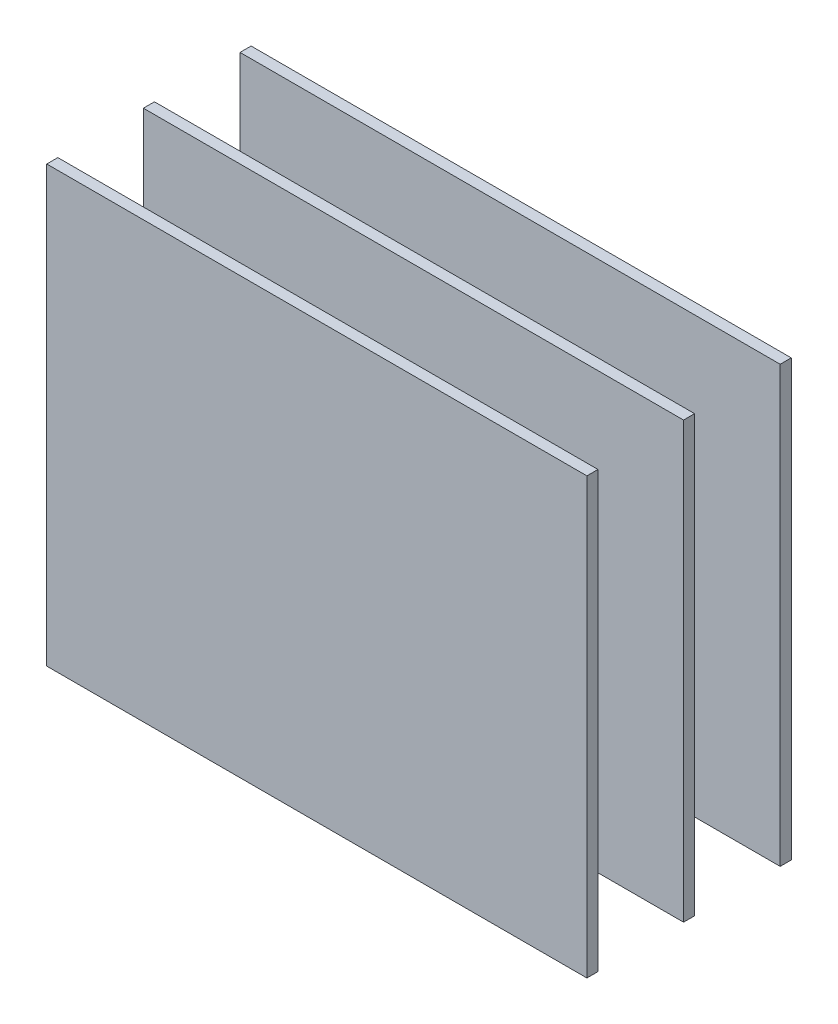
ISO-10303-21;
HEADER;
FILE_DESCRIPTION(('STEP AP214'),'2;1');
FILE_NAME('part.step','',(''),(''),'','','');
FILE_SCHEMA(('AUTOMOTIVE_DESIGN { 1 0 10303 214 1 1 1 1 }'));
ENDSEC;
DATA;
#1=APPLICATION_CONTEXT('core data for automotive mechanical design processes');
#2=APPLICATION_PROTOCOL_DEFINITION('international standard','automotive_design',2000,#1);
#3=PRODUCT_CONTEXT('',#1,'mechanical');
#4=PRODUCT('Part','Part','',(#3));
#5=PRODUCT_RELATED_PRODUCT_CATEGORY('part','',(#4));
#6=PRODUCT_DEFINITION_FORMATION('','',#4);
#7=PRODUCT_DEFINITION_CONTEXT('part definition',#1,'design');
#8=PRODUCT_DEFINITION('design','',#6,#7);
#9=PRODUCT_DEFINITION_SHAPE('','',#8);
#10=(LENGTH_UNIT() NAMED_UNIT(*) SI_UNIT(.MILLI.,.METRE.));
#11=(NAMED_UNIT(*) PLANE_ANGLE_UNIT() SI_UNIT($,.RADIAN.));
#12=(NAMED_UNIT(*) SI_UNIT($,.STERADIAN.) SOLID_ANGLE_UNIT());
#13=UNCERTAINTY_MEASURE_WITH_UNIT(LENGTH_MEASURE(1.E-05),#10,'distance_accuracy_value','');
#14=(GEOMETRIC_REPRESENTATION_CONTEXT(3) GLOBAL_UNCERTAINTY_ASSIGNED_CONTEXT((#13)) GLOBAL_UNIT_ASSIGNED_CONTEXT((#10,
#11,#12)) REPRESENTATION_CONTEXT('',''));
#15=CARTESIAN_POINT('',(0.,0.,0.));
#16=DIRECTION('',(0.,0.,1.));
#17=DIRECTION('',(1.,0.,0.));
#18=AXIS2_PLACEMENT_3D('',#15,#16,#17);
#19=CARTESIAN_POINT('',(-1.05,-0.675,0.));
#20=DIRECTION('',(0.,-1.,0.));
#21=DIRECTION('',(0.,0.,-1.));
#22=AXIS2_PLACEMENT_3D('',#19,#20,#21);
#23=PLANE('',#22);
#24=DIRECTION('',(0.,0.,-1.));
#25=VECTOR('',#24,1.);
#26=CARTESIAN_POINT('',(0.838391795984,-0.675,0.171094755903));
#27=LINE('',#26,#25);
#28=CARTESIAN_POINT('',(0.838391795984,-0.675,0.342189511805));
#29=VERTEX_POINT('',#28);
#30=CARTESIAN_POINT('',(0.838391795984,-0.675,0.307810488195));
#31=VERTEX_POINT('',#30);
#32=EDGE_CURVE('P0_E61',#29,#31,#27,.T.);
#33=ORIENTED_EDGE('',*,*,#32,.F.);
#34=DIRECTION('',(1.,0.,0.));
#35=VECTOR('',#34,1.);
#36=CARTESIAN_POINT('',(-0.944195897992,-0.675,0.342189511805));
#37=LINE('',#36,#35);
#38=CARTESIAN_POINT('',(-0.838391795984,-0.675,0.342189511805));
#39=VERTEX_POINT('',#38);
#40=EDGE_CURVE('P0_E11',#39,#29,#37,.T.);
#41=ORIENTED_EDGE('',*,*,#40,.F.);
#42=DIRECTION('',(0.,0.,1.));
#43=VECTOR('',#42,1.);
#44=CARTESIAN_POINT('',(-0.838391795984,-0.675,0.153905244097));
#45=LINE('',#44,#43);
#46=CARTESIAN_POINT('',(-0.838391795984,-0.675,0.307810488195));
#47=VERTEX_POINT('',#46);
#48=EDGE_CURVE('P0_E75',#47,#39,#45,.T.);
#49=ORIENTED_EDGE('',*,*,#48,.F.);
#50=DIRECTION('',(-1.,0.,0.));
#51=VECTOR('',#50,1.);
#52=CARTESIAN_POINT('',(-0.105804102008,-0.675,0.307810488195));
#53=LINE('',#52,#51);
#54=EDGE_CURVE('P0_E73',#31,#47,#53,.T.);
#55=ORIENTED_EDGE('',*,*,#54,.F.);
#56=EDGE_LOOP('',(#33,#41,#49,#55));
#57=FACE_BOUND('',#56,.T.);
#58=ADVANCED_FACE('P0_F17',(#57),#23,.T.);
#59=CARTESIAN_POINT('',(1.05,0.675,0.));
#60=DIRECTION('',(0.,1.,0.));
#61=DIRECTION('',(1.,0.,0.));
#62=AXIS2_PLACEMENT_3D('',#59,#60,#61);
#63=PLANE('',#62);
#64=DIRECTION('',(0.,0.,1.));
#65=VECTOR('',#64,1.);
#66=CARTESIAN_POINT('',(0.838391795984,0.675,0.171094755903));
#67=LINE('',#66,#65);
#68=CARTESIAN_POINT('',(0.838391795984,0.675,0.307810488195));
#69=VERTEX_POINT('',#68);
#70=CARTESIAN_POINT('',(0.838391795984,0.675,0.342189511805));
#71=VERTEX_POINT('',#70);
#72=EDGE_CURVE('P0_E80',#69,#71,#67,.T.);
#73=ORIENTED_EDGE('',*,*,#72,.F.);
#74=DIRECTION('',(1.,0.,0.));
#75=VECTOR('',#74,1.);
#76=CARTESIAN_POINT('',(0.944195897992,0.675,0.307810488195));
#77=LINE('',#76,#75);
#78=CARTESIAN_POINT('',(-0.838391795984,0.675,0.307810488195));
#79=VERTEX_POINT('',#78);
#80=EDGE_CURVE('P0_E84',#79,#69,#77,.T.);
#81=ORIENTED_EDGE('',*,*,#80,.F.);
#82=DIRECTION('',(0.,0.,-1.));
#83=VECTOR('',#82,1.);
#84=CARTESIAN_POINT('',(-0.838391795984,0.675,0.153905244097));
#85=LINE('',#84,#83);
#86=CARTESIAN_POINT('',(-0.838391795984,0.675,0.342189511805));
#87=VERTEX_POINT('',#86);
#88=EDGE_CURVE('P0_E124',#87,#79,#85,.T.);
#89=ORIENTED_EDGE('',*,*,#88,.F.);
#90=DIRECTION('',(-1.,0.,0.));
#91=VECTOR('',#90,1.);
#92=CARTESIAN_POINT('',(0.105804102008,0.675,0.342189511805));
#93=LINE('',#92,#91);
#94=EDGE_CURVE('P0_E20',#71,#87,#93,.T.);
#95=ORIENTED_EDGE('',*,*,#94,.F.);
#96=EDGE_LOOP('',(#73,#81,#89,#95));
#97=FACE_BOUND('',#96,.T.);
#98=ADVANCED_FACE('P0_F157',(#97),#63,.T.);
#99=CARTESIAN_POINT('',(-0.838391795984,0.675,0.342189511805));
#100=DIRECTION('',(0.,0.,1.));
#101=DIRECTION('',(1.,0.,0.));
#102=AXIS2_PLACEMENT_3D('',#99,#100,#101);
#103=PLANE('',#102);
#104=ORIENTED_EDGE('',*,*,#94,.T.);
#105=DIRECTION('',(0.,-1.,0.));
#106=VECTOR('',#105,1.);
#107=CARTESIAN_POINT('',(-0.838391795984,0.675,0.342189511805));
#108=LINE('',#107,#106);
#109=EDGE_CURVE('P0_E91',#87,#39,#108,.T.);
#110=ORIENTED_EDGE('',*,*,#109,.T.);
#111=ORIENTED_EDGE('',*,*,#40,.T.);
#112=DIRECTION('',(0.,-1.,0.));
#113=VECTOR('',#112,1.);
#114=CARTESIAN_POINT('',(0.838391795984,0.675,0.342189511805));
#115=LINE('',#114,#113);
#116=EDGE_CURVE('P0_E68',#71,#29,#115,.T.);
#117=ORIENTED_EDGE('',*,*,#116,.F.);
#118=EDGE_LOOP('',(#104,#110,#111,#117));
#119=FACE_BOUND('',#118,.T.);
#120=ADVANCED_FACE('P0_F143',(#119),#103,.T.);
#121=CARTESIAN_POINT('',(0.838391795984,0.675,0.342189511805));
#122=DIRECTION('',(1.,0.,0.));
#123=DIRECTION('',(0.,1.,0.));
#124=AXIS2_PLACEMENT_3D('',#121,#122,#123);
#125=PLANE('',#124);
#126=ORIENTED_EDGE('',*,*,#72,.T.);
#127=ORIENTED_EDGE('',*,*,#116,.T.);
#128=ORIENTED_EDGE('',*,*,#32,.T.);
#129=DIRECTION('',(0.,-1.,0.));
#130=VECTOR('',#129,1.);
#131=CARTESIAN_POINT('',(0.838391795984,0.675,0.307810488195));
#132=LINE('',#131,#130);
#133=EDGE_CURVE('P0_E66',#69,#31,#132,.T.);
#134=ORIENTED_EDGE('',*,*,#133,.F.);
#135=EDGE_LOOP('',(#126,#127,#128,#134));
#136=FACE_BOUND('',#135,.T.);
#137=ADVANCED_FACE('P0_F64',(#136),#125,.T.);
#138=CARTESIAN_POINT('',(0.838391795984,0.675,0.307810488195));
#139=DIRECTION('',(0.,0.,-1.));
#140=DIRECTION('',(0.,-1.,0.));
#141=AXIS2_PLACEMENT_3D('',#138,#139,#140);
#142=PLANE('',#141);
#143=ORIENTED_EDGE('',*,*,#80,.T.);
#144=ORIENTED_EDGE('',*,*,#133,.T.);
#145=ORIENTED_EDGE('',*,*,#54,.T.);
#146=DIRECTION('',(0.,1.,0.));
#147=VECTOR('',#146,1.);
#148=CARTESIAN_POINT('',(-0.838391795984,0.675,0.307810488195));
#149=LINE('',#148,#147);
#150=EDGE_CURVE('P0_E120',#47,#79,#149,.T.);
#151=ORIENTED_EDGE('',*,*,#150,.T.);
#152=EDGE_LOOP('',(#143,#144,#145,#151));
#153=FACE_BOUND('',#152,.T.);
#154=ADVANCED_FACE('P0_F82',(#153),#142,.T.);
#155=CARTESIAN_POINT('',(-0.838391795984,0.675,0.307810488195));
#156=DIRECTION('',(-1.,0.,0.));
#157=DIRECTION('',(0.,0.,1.));
#158=AXIS2_PLACEMENT_3D('',#155,#156,#157);
#159=PLANE('',#158);
#160=ORIENTED_EDGE('',*,*,#88,.T.);
#161=ORIENTED_EDGE('',*,*,#150,.F.);
#162=ORIENTED_EDGE('',*,*,#48,.T.);
#163=ORIENTED_EDGE('',*,*,#109,.F.);
#164=EDGE_LOOP('',(#160,#161,#162,#163));
#165=FACE_BOUND('',#164,.T.);
#166=ADVANCED_FACE('P0_F147',(#165),#159,.T.);
#167=CLOSED_SHELL('',(#58,#98,#120,#137,#154,#166));
#168=MANIFOLD_SOLID_BREP('P0_B1',#167);
#169=CARTESIAN_POINT('',(-1.05,-0.675,0.));
#170=DIRECTION('',(0.,-1.,0.));
#171=DIRECTION('',(0.,0.,-1.));
#172=AXIS2_PLACEMENT_3D('',#169,#170,#171);
#173=PLANE('',#172);
#174=DIRECTION('',(0.,0.,-1.));
#175=VECTOR('',#174,1.);
#176=CARTESIAN_POINT('',(0.838391795984,-0.675,0.471094755903));
#177=LINE('',#176,#175);
#178=CARTESIAN_POINT('',(0.838391795984,-0.675,0.942189511805));
#179=VERTEX_POINT('',#178);
#180=CARTESIAN_POINT('',(0.838391795984,-0.675,0.907810488195));
#181=VERTEX_POINT('',#180);
#182=EDGE_CURVE('P1_E74',#179,#181,#177,.T.);
#183=ORIENTED_EDGE('',*,*,#182,.F.);
#184=DIRECTION('',(1.,0.,0.));
#185=VECTOR('',#184,1.);
#186=CARTESIAN_POINT('',(-0.944195897992,-0.675,0.942189511805));
#187=LINE('',#186,#185);
#188=CARTESIAN_POINT('',(-0.838391795984,-0.675,0.942189511805));
#189=VERTEX_POINT('',#188);
#190=EDGE_CURVE('P1_E11',#189,#179,#187,.T.);
#191=ORIENTED_EDGE('',*,*,#190,.F.);
#192=DIRECTION('',(0.,0.,1.));
#193=VECTOR('',#192,1.);
#194=CARTESIAN_POINT('',(-0.838391795984,-0.675,0.453905244097));
#195=LINE('',#194,#193);
#196=CARTESIAN_POINT('',(-0.838391795984,-0.675,0.907810488195));
#197=VERTEX_POINT('',#196);
#198=EDGE_CURVE('P1_E82',#197,#189,#195,.T.);
#199=ORIENTED_EDGE('',*,*,#198,.F.);
#200=DIRECTION('',(-1.,0.,0.));
#201=VECTOR('',#200,1.);
#202=CARTESIAN_POINT('',(-0.105804102008,-0.675,0.907810488195));
#203=LINE('',#202,#201);
#204=EDGE_CURVE('P1_E105',#181,#197,#203,.T.);
#205=ORIENTED_EDGE('',*,*,#204,.F.);
#206=EDGE_LOOP('',(#183,#191,#199,#205));
#207=FACE_BOUND('',#206,.T.);
#208=ADVANCED_FACE('P1_F17',(#207),#173,.T.);
#209=CARTESIAN_POINT('',(1.05,0.675,0.));
#210=DIRECTION('',(0.,1.,0.));
#211=DIRECTION('',(1.,0.,0.));
#212=AXIS2_PLACEMENT_3D('',#209,#210,#211);
#213=PLANE('',#212);
#214=DIRECTION('',(0.,0.,1.));
#215=VECTOR('',#214,1.);
#216=CARTESIAN_POINT('',(0.838391795984,0.675,0.471094755903));
#217=LINE('',#216,#215);
#218=CARTESIAN_POINT('',(0.838391795984,0.675,0.907810488195));
#219=VERTEX_POINT('',#218);
#220=CARTESIAN_POINT('',(0.838391795984,0.675,0.942189511805));
#221=VERTEX_POINT('',#220);
#222=EDGE_CURVE('P1_E110',#219,#221,#217,.T.);
#223=ORIENTED_EDGE('',*,*,#222,.F.);
#224=DIRECTION('',(1.,0.,0.));
#225=VECTOR('',#224,1.);
#226=CARTESIAN_POINT('',(0.944195897992,0.675,0.907810488195));
#227=LINE('',#226,#225);
#228=CARTESIAN_POINT('',(-0.838391795984,0.675,0.907810488195));
#229=VERTEX_POINT('',#228);
#230=EDGE_CURVE('P1_E84',#229,#219,#227,.T.);
#231=ORIENTED_EDGE('',*,*,#230,.F.);
#232=DIRECTION('',(0.,0.,-1.));
#233=VECTOR('',#232,1.);
#234=CARTESIAN_POINT('',(-0.838391795984,0.675,0.453905244097));
#235=LINE('',#234,#233);
#236=CARTESIAN_POINT('',(-0.838391795984,0.675,0.942189511805));
#237=VERTEX_POINT('',#236);
#238=EDGE_CURVE('P1_E80',#237,#229,#235,.T.);
#239=ORIENTED_EDGE('',*,*,#238,.F.);
#240=DIRECTION('',(-1.,0.,0.));
#241=VECTOR('',#240,1.);
#242=CARTESIAN_POINT('',(0.105804102008,0.675,0.942189511805));
#243=LINE('',#242,#241);
#244=EDGE_CURVE('P1_E26',#221,#237,#243,.T.);
#245=ORIENTED_EDGE('',*,*,#244,.F.);
#246=EDGE_LOOP('',(#223,#231,#239,#245));
#247=FACE_BOUND('',#246,.T.);
#248=ADVANCED_FACE('P1_F86',(#247),#213,.T.);
#249=CARTESIAN_POINT('',(-0.838391795984,0.675,0.942189511805));
#250=DIRECTION('',(0.,0.,1.));
#251=DIRECTION('',(1.,0.,0.));
#252=AXIS2_PLACEMENT_3D('',#249,#250,#251);
#253=PLANE('',#252);
#254=ORIENTED_EDGE('',*,*,#244,.T.);
#255=DIRECTION('',(0.,-1.,0.));
#256=VECTOR('',#255,1.);
#257=CARTESIAN_POINT('',(-0.838391795984,0.675,0.942189511805));
#258=LINE('',#257,#256);
#259=EDGE_CURVE('P1_E69',#237,#189,#258,.T.);
#260=ORIENTED_EDGE('',*,*,#259,.T.);
#261=ORIENTED_EDGE('',*,*,#190,.T.);
#262=DIRECTION('',(0.,-1.,0.));
#263=VECTOR('',#262,1.);
#264=CARTESIAN_POINT('',(0.838391795984,0.675,0.942189511805));
#265=LINE('',#264,#263);
#266=EDGE_CURVE('P1_E20',#221,#179,#265,.T.);
#267=ORIENTED_EDGE('',*,*,#266,.F.);
#268=EDGE_LOOP('',(#254,#260,#261,#267));
#269=FACE_BOUND('',#268,.T.);
#270=ADVANCED_FACE('P1_F68',(#269),#253,.T.);
#271=CARTESIAN_POINT('',(0.838391795984,0.675,0.942189511805));
#272=DIRECTION('',(1.,0.,0.));
#273=DIRECTION('',(0.,1.,0.));
#274=AXIS2_PLACEMENT_3D('',#271,#272,#273);
#275=PLANE('',#274);
#276=ORIENTED_EDGE('',*,*,#222,.T.);
#277=ORIENTED_EDGE('',*,*,#266,.T.);
#278=ORIENTED_EDGE('',*,*,#182,.T.);
#279=DIRECTION('',(0.,-1.,0.));
#280=VECTOR('',#279,1.);
#281=CARTESIAN_POINT('',(0.838391795984,0.675,0.907810488195));
#282=LINE('',#281,#280);
#283=EDGE_CURVE('P1_E102',#219,#181,#282,.T.);
#284=ORIENTED_EDGE('',*,*,#283,.F.);
#285=EDGE_LOOP('',(#276,#277,#278,#284));
#286=FACE_BOUND('',#285,.T.);
#287=ADVANCED_FACE('P1_F120',(#286),#275,.T.);
#288=CARTESIAN_POINT('',(0.838391795984,0.675,0.907810488195));
#289=DIRECTION('',(0.,0.,-1.));
#290=DIRECTION('',(0.,-1.,0.));
#291=AXIS2_PLACEMENT_3D('',#288,#289,#290);
#292=PLANE('',#291);
#293=ORIENTED_EDGE('',*,*,#230,.T.);
#294=ORIENTED_EDGE('',*,*,#283,.T.);
#295=ORIENTED_EDGE('',*,*,#204,.T.);
#296=DIRECTION('',(0.,1.,0.));
#297=VECTOR('',#296,1.);
#298=CARTESIAN_POINT('',(-0.838391795984,0.675,0.907810488195));
#299=LINE('',#298,#297);
#300=EDGE_CURVE('P1_E90',#197,#229,#299,.T.);
#301=ORIENTED_EDGE('',*,*,#300,.T.);
#302=EDGE_LOOP('',(#293,#294,#295,#301));
#303=FACE_BOUND('',#302,.T.);
#304=ADVANCED_FACE('P1_F124',(#303),#292,.T.);
#305=CARTESIAN_POINT('',(-0.838391795984,0.675,0.907810488195));
#306=DIRECTION('',(-1.,0.,0.));
#307=DIRECTION('',(0.,0.,1.));
#308=AXIS2_PLACEMENT_3D('',#305,#306,#307);
#309=PLANE('',#308);
#310=ORIENTED_EDGE('',*,*,#238,.T.);
#311=ORIENTED_EDGE('',*,*,#300,.F.);
#312=ORIENTED_EDGE('',*,*,#198,.T.);
#313=ORIENTED_EDGE('',*,*,#259,.F.);
#314=EDGE_LOOP('',(#310,#311,#312,#313));
#315=FACE_BOUND('',#314,.T.);
#316=ADVANCED_FACE('P1_F78',(#315),#309,.T.);
#317=CLOSED_SHELL('',(#208,#248,#270,#287,#304,#316));
#318=MANIFOLD_SOLID_BREP('P1_B1',#317);
#319=CARTESIAN_POINT('',(-0.838391795984,0.675,0.607810488195));
#320=DIRECTION('',(-1.,0.,0.));
#321=DIRECTION('',(0.,0.,1.));
#322=AXIS2_PLACEMENT_3D('',#319,#320,#321);
#323=PLANE('',#322);
#324=DIRECTION('',(0.,0.,-1.));
#325=VECTOR('',#324,1.);
#326=CARTESIAN_POINT('',(-0.838391795984,0.675,0.303905244097));
#327=LINE('',#326,#325);
#328=CARTESIAN_POINT('',(-0.838391795984,0.675,0.642189511805));
#329=VERTEX_POINT('',#328);
#330=CARTESIAN_POINT('',(-0.838391795984,0.675,0.607810488195));
#331=VERTEX_POINT('',#330);
#332=EDGE_CURVE('P2_E105',#329,#331,#327,.T.);
#333=ORIENTED_EDGE('',*,*,#332,.T.);
#334=DIRECTION('',(0.,1.,0.));
#335=VECTOR('',#334,1.);
#336=CARTESIAN_POINT('',(-0.838391795984,0.675,0.607810488195));
#337=LINE('',#336,#335);
#338=CARTESIAN_POINT('',(-0.838391795984,-0.675,0.607810488195));
#339=VERTEX_POINT('',#338);
#340=EDGE_CURVE('P2_E11',#339,#331,#337,.T.);
#341=ORIENTED_EDGE('',*,*,#340,.F.);
#342=DIRECTION('',(0.,0.,1.));
#343=VECTOR('',#342,1.);
#344=CARTESIAN_POINT('',(-0.838391795984,-0.675,0.303905244097));
#345=LINE('',#344,#343);
#346=CARTESIAN_POINT('',(-0.838391795984,-0.675,0.642189511805));
#347=VERTEX_POINT('',#346);
#348=EDGE_CURVE('P2_E86',#339,#347,#345,.T.);
#349=ORIENTED_EDGE('',*,*,#348,.T.);
#350=DIRECTION('',(0.,-1.,0.));
#351=VECTOR('',#350,1.);
#352=CARTESIAN_POINT('',(-0.838391795984,0.675,0.642189511805));
#353=LINE('',#352,#351);
#354=EDGE_CURVE('P2_E38',#329,#347,#353,.T.);
#355=ORIENTED_EDGE('',*,*,#354,.F.);
#356=EDGE_LOOP('',(#333,#341,#349,#355));
#357=FACE_BOUND('',#356,.T.);
#358=ADVANCED_FACE('P2_F17',(#357),#323,.T.);
#359=CARTESIAN_POINT('',(0.838391795984,0.675,0.607810488195));
#360=DIRECTION('',(0.,0.,-1.));
#361=DIRECTION('',(0.,-1.,0.));
#362=AXIS2_PLACEMENT_3D('',#359,#360,#361);
#363=PLANE('',#362);
#364=DIRECTION('',(1.,0.,0.));
#365=VECTOR('',#364,1.);
#366=CARTESIAN_POINT('',(0.944195897992,0.675,0.607810488195));
#367=LINE('',#366,#365);
#368=CARTESIAN_POINT('',(0.838391795984,0.675,0.607810488195));
#369=VERTEX_POINT('',#368);
#370=EDGE_CURVE('P2_E74',#331,#369,#367,.T.);
#371=ORIENTED_EDGE('',*,*,#370,.T.);
#372=DIRECTION('',(0.,-1.,0.));
#373=VECTOR('',#372,1.);
#374=CARTESIAN_POINT('',(0.838391795984,0.675,0.607810488195));
#375=LINE('',#374,#373);
#376=CARTESIAN_POINT('',(0.838391795984,-0.675,0.607810488195));
#377=VERTEX_POINT('',#376);
#378=EDGE_CURVE('P2_E20',#369,#377,#375,.T.);
#379=ORIENTED_EDGE('',*,*,#378,.T.);
#380=DIRECTION('',(-1.,0.,0.));
#381=VECTOR('',#380,1.);
#382=CARTESIAN_POINT('',(-0.105804102008,-0.675,0.607810488195));
#383=LINE('',#382,#381);
#384=EDGE_CURVE('P2_E71',#377,#339,#383,.T.);
#385=ORIENTED_EDGE('',*,*,#384,.T.);
#386=ORIENTED_EDGE('',*,*,#340,.T.);
#387=EDGE_LOOP('',(#371,#379,#385,#386));
#388=FACE_BOUND('',#387,.T.);
#389=ADVANCED_FACE('P2_F70',(#388),#363,.T.);
#390=CARTESIAN_POINT('',(0.838391795984,0.675,0.642189511805));
#391=DIRECTION('',(1.,0.,0.));
#392=DIRECTION('',(0.,1.,0.));
#393=AXIS2_PLACEMENT_3D('',#390,#391,#392);
#394=PLANE('',#393);
#395=DIRECTION('',(0.,0.,1.));
#396=VECTOR('',#395,1.);
#397=CARTESIAN_POINT('',(0.838391795984,0.675,0.321094755903));
#398=LINE('',#397,#396);
#399=CARTESIAN_POINT('',(0.838391795984,0.675,0.642189511805));
#400=VERTEX_POINT('',#399);
#401=EDGE_CURVE('P2_E88',#369,#400,#398,.T.);
#402=ORIENTED_EDGE('',*,*,#401,.T.);
#403=DIRECTION('',(0.,-1.,0.));
#404=VECTOR('',#403,1.);
#405=CARTESIAN_POINT('',(0.838391795984,0.675,0.642189511805));
#406=LINE('',#405,#404);
#407=CARTESIAN_POINT('',(0.838391795984,-0.675,0.642189511805));
#408=VERTEX_POINT('',#407);
#409=EDGE_CURVE('P2_E80',#400,#408,#406,.T.);
#410=ORIENTED_EDGE('',*,*,#409,.T.);
#411=DIRECTION('',(0.,0.,-1.));
#412=VECTOR('',#411,1.);
#413=CARTESIAN_POINT('',(0.838391795984,-0.675,0.321094755903));
#414=LINE('',#413,#412);
#415=EDGE_CURVE('P2_E85',#408,#377,#414,.T.);
#416=ORIENTED_EDGE('',*,*,#415,.T.);
#417=ORIENTED_EDGE('',*,*,#378,.F.);
#418=EDGE_LOOP('',(#402,#410,#416,#417));
#419=FACE_BOUND('',#418,.T.);
#420=ADVANCED_FACE('P2_F90',(#419),#394,.T.);
#421=CARTESIAN_POINT('',(-0.838391795984,0.675,0.642189511805));
#422=DIRECTION('',(0.,0.,1.));
#423=DIRECTION('',(1.,0.,0.));
#424=AXIS2_PLACEMENT_3D('',#421,#422,#423);
#425=PLANE('',#424);
#426=DIRECTION('',(-1.,0.,0.));
#427=VECTOR('',#426,1.);
#428=CARTESIAN_POINT('',(0.105804102008,0.675,0.642189511805));
#429=LINE('',#428,#427);
#430=EDGE_CURVE('P2_E108',#400,#329,#429,.T.);
#431=ORIENTED_EDGE('',*,*,#430,.T.);
#432=ORIENTED_EDGE('',*,*,#354,.T.);
#433=DIRECTION('',(1.,0.,0.));
#434=VECTOR('',#433,1.);
#435=CARTESIAN_POINT('',(-0.944195897992,-0.675,0.642189511805));
#436=LINE('',#435,#434);
#437=EDGE_CURVE('P2_E93',#347,#408,#436,.T.);
#438=ORIENTED_EDGE('',*,*,#437,.T.);
#439=ORIENTED_EDGE('',*,*,#409,.F.);
#440=EDGE_LOOP('',(#431,#432,#438,#439));
#441=FACE_BOUND('',#440,.T.);
#442=ADVANCED_FACE('P2_F169',(#441),#425,.T.);
#443=CARTESIAN_POINT('',(1.05,0.675,0.));
#444=DIRECTION('',(0.,1.,0.));
#445=DIRECTION('',(1.,0.,0.));
#446=AXIS2_PLACEMENT_3D('',#443,#444,#445);
#447=PLANE('',#446);
#448=ORIENTED_EDGE('',*,*,#401,.F.);
#449=ORIENTED_EDGE('',*,*,#370,.F.);
#450=ORIENTED_EDGE('',*,*,#332,.F.);
#451=ORIENTED_EDGE('',*,*,#430,.F.);
#452=EDGE_LOOP('',(#448,#449,#450,#451));
#453=FACE_BOUND('',#452,.T.);
#454=ADVANCED_FACE('P2_F157',(#453),#447,.T.);
#455=CARTESIAN_POINT('',(-1.05,-0.675,0.));
#456=DIRECTION('',(0.,-1.,0.));
#457=DIRECTION('',(0.,0.,-1.));
#458=AXIS2_PLACEMENT_3D('',#455,#456,#457);
#459=PLANE('',#458);
#460=ORIENTED_EDGE('',*,*,#415,.F.);
#461=ORIENTED_EDGE('',*,*,#437,.F.);
#462=ORIENTED_EDGE('',*,*,#348,.F.);
#463=ORIENTED_EDGE('',*,*,#384,.F.);
#464=EDGE_LOOP('',(#460,#461,#462,#463));
#465=FACE_BOUND('',#464,.T.);
#466=ADVANCED_FACE('P2_F83',(#465),#459,.T.);
#467=CLOSED_SHELL('',(#358,#389,#420,#442,#454,#466));
#468=MANIFOLD_SOLID_BREP('P2_B1',#467);
#469=ADVANCED_BREP_SHAPE_REPRESENTATION('',(#18,#168,#318,#468),#14);
#470=SHAPE_DEFINITION_REPRESENTATION(#9,#469);
ENDSEC;
END-ISO-10303-21;
